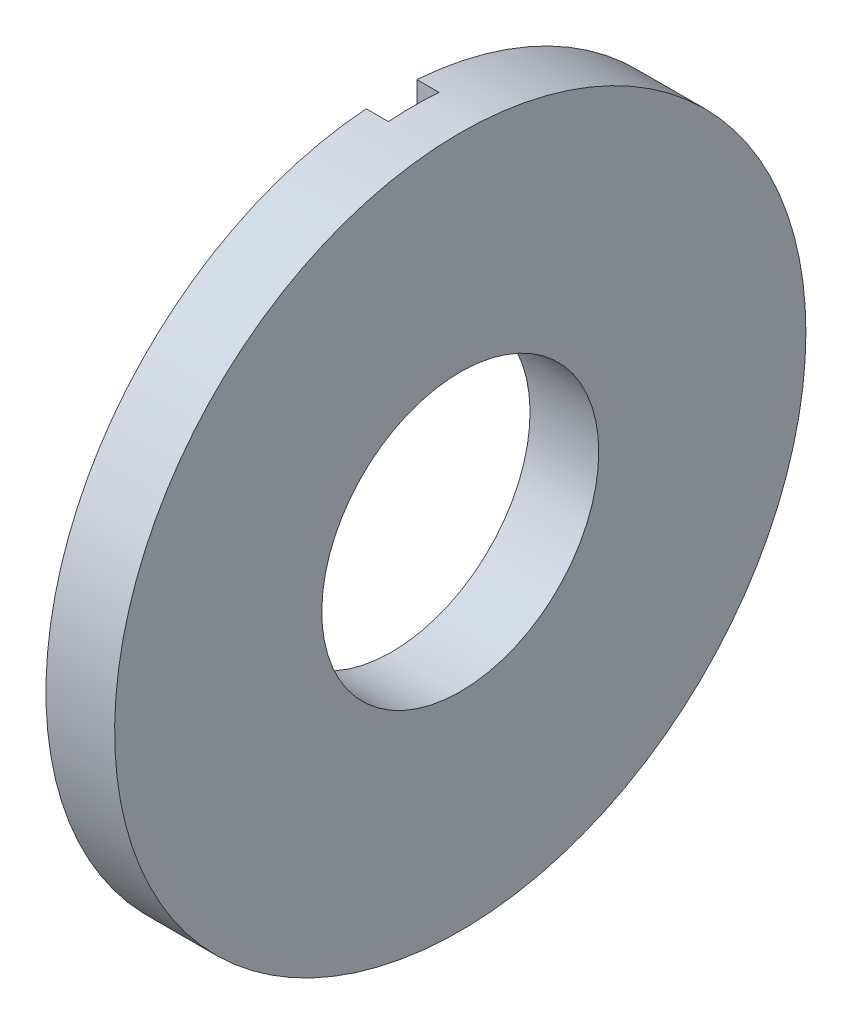
ISO-10303-21;
HEADER;
FILE_DESCRIPTION(('STEP AP214'),'2;1');
FILE_NAME('part.step','',(''),(''),'','','');
FILE_SCHEMA(('AUTOMOTIVE_DESIGN { 1 0 10303 214 1 1 1 1 }'));
ENDSEC;
DATA;
#1=APPLICATION_CONTEXT('core data for automotive mechanical design processes');
#2=APPLICATION_PROTOCOL_DEFINITION('international standard','automotive_design',2000,#1);
#3=PRODUCT_CONTEXT('',#1,'mechanical');
#4=PRODUCT('Part','Part','',(#3));
#5=PRODUCT_RELATED_PRODUCT_CATEGORY('part','',(#4));
#6=PRODUCT_DEFINITION_FORMATION('','',#4);
#7=PRODUCT_DEFINITION_CONTEXT('part definition',#1,'design');
#8=PRODUCT_DEFINITION('design','',#6,#7);
#9=PRODUCT_DEFINITION_SHAPE('','',#8);
#10=(LENGTH_UNIT() NAMED_UNIT(*) SI_UNIT(.MILLI.,.METRE.));
#11=(NAMED_UNIT(*) PLANE_ANGLE_UNIT() SI_UNIT($,.RADIAN.));
#12=(NAMED_UNIT(*) SI_UNIT($,.STERADIAN.) SOLID_ANGLE_UNIT());
#13=UNCERTAINTY_MEASURE_WITH_UNIT(LENGTH_MEASURE(1.E-05),#10,'distance_accuracy_value','');
#14=(GEOMETRIC_REPRESENTATION_CONTEXT(3) GLOBAL_UNCERTAINTY_ASSIGNED_CONTEXT((#13)) GLOBAL_UNIT_ASSIGNED_CONTEXT((#10,
#11,#12)) REPRESENTATION_CONTEXT('',''));
#15=CARTESIAN_POINT('',(0.,0.,0.));
#16=DIRECTION('',(0.,0.,1.));
#17=DIRECTION('',(1.,0.,0.));
#18=AXIS2_PLACEMENT_3D('',#15,#16,#17);
#19=CARTESIAN_POINT('',(0.3937,0.,0.));
#20=DIRECTION('',(1.,0.,0.));
#21=DIRECTION('',(0.,0.,-1.));
#22=AXIS2_PLACEMENT_3D('',#19,#20,#21);
#23=PLANE('',#22);
#24=CARTESIAN_POINT('',(0.3937,0.,0.));
#25=DIRECTION('',(1.,0.,0.));
#26=DIRECTION('',(0.,0.,-1.));
#27=AXIS2_PLACEMENT_3D('',#24,#25,#26);
#28=CIRCLE('',#27,3.9624);
#29=CARTESIAN_POINT('',(0.3937,0.,-3.9624));
#30=VERTEX_POINT('',#29);
#31=EDGE_CURVE('E112',#30,#30,#28,.T.);
#32=ORIENTED_EDGE('',*,*,#31,.T.);
#33=EDGE_LOOP('',(#32));
#34=FACE_BOUND('',#33,.T.);
#35=CARTESIAN_POINT('',(0.3937,0.,0.));
#36=DIRECTION('',(1.,0.,0.));
#37=DIRECTION('',(0.,0.,-1.));
#38=AXIS2_PLACEMENT_3D('',#35,#36,#37);
#39=CIRCLE('',#38,1.5875);
#40=CARTESIAN_POINT('',(0.3937,0.,-1.5875));
#41=VERTEX_POINT('',#40);
#42=EDGE_CURVE('E102',#41,#41,#39,.T.);
#43=ORIENTED_EDGE('',*,*,#42,.F.);
#44=EDGE_LOOP('',(#43));
#45=FACE_BOUND('',#44,.T.);
#46=ADVANCED_FACE('F39',(#34,#45),#23,.T.);
#47=CARTESIAN_POINT('',(-0.3937,0.,0.));
#48=DIRECTION('',(1.,0.,0.));
#49=DIRECTION('',(0.,0.,-1.));
#50=AXIS2_PLACEMENT_3D('',#47,#48,#49);
#51=PLANE('',#50);
#52=CARTESIAN_POINT('',(-0.3937,0.,0.));
#53=DIRECTION('',(1.,0.,0.));
#54=DIRECTION('',(0.,0.,-1.));
#55=AXIS2_PLACEMENT_3D('',#52,#53,#54);
#56=CIRCLE('',#55,3.9624);
#57=CARTESIAN_POINT('',(-0.3937,3.95175620378205,0.290235535160832));
#58=VERTEX_POINT('',#57);
#59=CARTESIAN_POINT('',(-0.3937,3.95175620378205,-0.290235535160832));
#60=VERTEX_POINT('',#59);
#61=EDGE_CURVE('E94',#58,#60,#56,.T.);
#62=ORIENTED_EDGE('',*,*,#61,.F.);
#63=DIRECTION('',(0.,1.,0.));
#64=VECTOR('',#63,1.);
#65=CARTESIAN_POINT('',(-0.3937,0.,0.290235535160832));
#66=LINE('',#65,#64);
#67=CARTESIAN_POINT('',(-0.3937,1.56074327938002,0.290235535160832));
#68=VERTEX_POINT('',#67);
#69=EDGE_CURVE('E81',#68,#58,#66,.T.);
#70=ORIENTED_EDGE('',*,*,#69,.F.);
#71=CARTESIAN_POINT('',(-0.3937,0.,0.));
#72=DIRECTION('',(1.,0.,0.));
#73=DIRECTION('',(0.,0.,-1.));
#74=AXIS2_PLACEMENT_3D('',#71,#72,#73);
#75=CIRCLE('',#74,1.5875);
#76=CARTESIAN_POINT('',(-0.3937,1.56074327938002,-0.290235535160832));
#77=VERTEX_POINT('',#76);
#78=EDGE_CURVE('E92',#68,#77,#75,.T.);
#79=ORIENTED_EDGE('',*,*,#78,.T.);
#80=DIRECTION('',(0.,-1.,0.));
#81=VECTOR('',#80,1.);
#82=CARTESIAN_POINT('',(-0.3937,0.,-0.290235535160832));
#83=LINE('',#82,#81);
#84=EDGE_CURVE('E96',#60,#77,#83,.T.);
#85=ORIENTED_EDGE('',*,*,#84,.F.);
#86=EDGE_LOOP('',(#62,#70,#79,#85));
#87=FACE_BOUND('',#86,.T.);
#88=ADVANCED_FACE('F90',(#87),#51,.F.);
#89=CARTESIAN_POINT('',(0.3937,0.,0.));
#90=DIRECTION('',(-1.,0.,0.));
#91=DIRECTION('',(0.,0.,1.));
#92=AXIS2_PLACEMENT_3D('',#89,#90,#91);
#93=CYLINDRICAL_SURFACE('',#92,3.9624);
#94=ORIENTED_EDGE('',*,*,#31,.F.);
#95=EDGE_LOOP('',(#94));
#96=FACE_BOUND('',#95,.T.);
#97=CARTESIAN_POINT('',(-0.1397,0.,0.));
#98=DIRECTION('',(1.,0.,0.));
#99=DIRECTION('',(0.,0.,-1.));
#100=AXIS2_PLACEMENT_3D('',#97,#98,#99);
#101=CIRCLE('',#100,3.9624);
#102=CARTESIAN_POINT('',(-0.1397,3.95175620378205,-0.290235535160832));
#103=VERTEX_POINT('',#102);
#104=CARTESIAN_POINT('',(-0.1397,3.95175620378205,0.290235535160832));
#105=VERTEX_POINT('',#104);
#106=EDGE_CURVE('E60',#103,#105,#101,.T.);
#107=ORIENTED_EDGE('',*,*,#106,.T.);
#108=DIRECTION('',(-1.,0.,0.));
#109=VECTOR('',#108,1.);
#110=CARTESIAN_POINT('',(0.3937,3.95175620378205,0.290235535160832));
#111=LINE('',#110,#109);
#112=EDGE_CURVE('E103',#105,#58,#111,.T.);
#113=ORIENTED_EDGE('',*,*,#112,.T.);
#114=ORIENTED_EDGE('',*,*,#61,.T.);
#115=DIRECTION('',(-1.,0.,0.));
#116=VECTOR('',#115,1.);
#117=CARTESIAN_POINT('',(0.3937,3.95175620378205,-0.290235535160832));
#118=LINE('',#117,#116);
#119=EDGE_CURVE('E109',#60,#103,#118,.F.);
#120=ORIENTED_EDGE('',*,*,#119,.T.);
#121=EDGE_LOOP('',(#107,#113,#114,#120));
#122=FACE_BOUND('',#121,.T.);
#123=ADVANCED_FACE('F41',(#96,#122),#93,.T.);
#124=CARTESIAN_POINT('',(0.3937,0.,0.));
#125=DIRECTION('',(-1.,0.,0.));
#126=DIRECTION('',(0.,0.,1.));
#127=AXIS2_PLACEMENT_3D('',#124,#125,#126);
#128=CYLINDRICAL_SURFACE('',#127,1.5875);
#129=DIRECTION('',(-1.,0.,0.));
#130=VECTOR('',#129,1.);
#131=CARTESIAN_POINT('',(0.3937,1.56074327938002,0.290235535160832));
#132=LINE('',#131,#130);
#133=CARTESIAN_POINT('',(-0.1397,1.56074327938002,0.290235535160832));
#134=VERTEX_POINT('',#133);
#135=EDGE_CURVE('E11',#134,#68,#132,.T.);
#136=ORIENTED_EDGE('',*,*,#135,.F.);
#137=CARTESIAN_POINT('',(-0.1397,0.,0.));
#138=DIRECTION('',(1.,0.,0.));
#139=DIRECTION('',(0.,0.,-1.));
#140=AXIS2_PLACEMENT_3D('',#137,#138,#139);
#141=CIRCLE('',#140,1.5875);
#142=CARTESIAN_POINT('',(-0.1397,1.56074327938002,-0.290235535160832));
#143=VERTEX_POINT('',#142);
#144=EDGE_CURVE('E116',#143,#134,#141,.T.);
#145=ORIENTED_EDGE('',*,*,#144,.F.);
#146=DIRECTION('',(-1.,0.,0.));
#147=VECTOR('',#146,1.);
#148=CARTESIAN_POINT('',(0.3937,1.56074327938002,-0.290235535160832));
#149=LINE('',#148,#147);
#150=EDGE_CURVE('E48',#77,#143,#149,.F.);
#151=ORIENTED_EDGE('',*,*,#150,.F.);
#152=ORIENTED_EDGE('',*,*,#78,.F.);
#153=EDGE_LOOP('',(#136,#145,#151,#152));
#154=FACE_BOUND('',#153,.T.);
#155=ORIENTED_EDGE('',*,*,#42,.T.);
#156=EDGE_LOOP('',(#155));
#157=FACE_BOUND('',#156,.T.);
#158=ADVANCED_FACE('F99',(#154,#157),#128,.F.);
#159=CARTESIAN_POINT('',(-0.1397,0.,0.290235535160832));
#160=DIRECTION('',(0.,0.,1.));
#161=DIRECTION('',(1.,0.,0.));
#162=AXIS2_PLACEMENT_3D('',#159,#160,#161);
#163=PLANE('',#162);
#164=DIRECTION('',(0.,1.,0.));
#165=VECTOR('',#164,1.);
#166=CARTESIAN_POINT('',(-0.1397,0.,0.290235535160832));
#167=LINE('',#166,#165);
#168=EDGE_CURVE('E83',#134,#105,#167,.T.);
#169=ORIENTED_EDGE('',*,*,#168,.F.);
#170=ORIENTED_EDGE('',*,*,#135,.T.);
#171=ORIENTED_EDGE('',*,*,#69,.T.);
#172=ORIENTED_EDGE('',*,*,#112,.F.);
#173=EDGE_LOOP('',(#169,#170,#171,#172));
#174=FACE_BOUND('',#173,.T.);
#175=ADVANCED_FACE('F79',(#174),#163,.F.);
#176=CARTESIAN_POINT('',(-0.1397,0.,-0.290235535160832));
#177=DIRECTION('',(0.,0.,-1.));
#178=DIRECTION('',(-1.,0.,0.));
#179=AXIS2_PLACEMENT_3D('',#176,#177,#178);
#180=PLANE('',#179);
#181=ORIENTED_EDGE('',*,*,#84,.T.);
#182=ORIENTED_EDGE('',*,*,#150,.T.);
#183=DIRECTION('',(0.,-1.,0.));
#184=VECTOR('',#183,1.);
#185=CARTESIAN_POINT('',(-0.1397,0.,-0.290235535160832));
#186=LINE('',#185,#184);
#187=EDGE_CURVE('E55',#103,#143,#186,.T.);
#188=ORIENTED_EDGE('',*,*,#187,.F.);
#189=ORIENTED_EDGE('',*,*,#119,.F.);
#190=EDGE_LOOP('',(#181,#182,#188,#189));
#191=FACE_BOUND('',#190,.T.);
#192=ADVANCED_FACE('F122',(#191),#180,.F.);
#193=CARTESIAN_POINT('',(-0.1397,0.,0.));
#194=DIRECTION('',(1.,0.,0.));
#195=DIRECTION('',(0.,0.,-1.));
#196=AXIS2_PLACEMENT_3D('',#193,#194,#195);
#197=PLANE('',#196);
#198=ORIENTED_EDGE('',*,*,#187,.T.);
#199=ORIENTED_EDGE('',*,*,#144,.T.);
#200=ORIENTED_EDGE('',*,*,#168,.T.);
#201=ORIENTED_EDGE('',*,*,#106,.F.);
#202=EDGE_LOOP('',(#198,#199,#200,#201));
#203=FACE_BOUND('',#202,.T.);
#204=ADVANCED_FACE('F124',(#203),#197,.F.);
#205=CLOSED_SHELL('',(#46,#88,#123,#158,#175,#192,#204));
#206=MANIFOLD_SOLID_BREP('B2',#205);
#207=ADVANCED_BREP_SHAPE_REPRESENTATION('',(#18,#206),#14);
#208=SHAPE_DEFINITION_REPRESENTATION(#9,#207);
ENDSEC;
END-ISO-10303-21;
